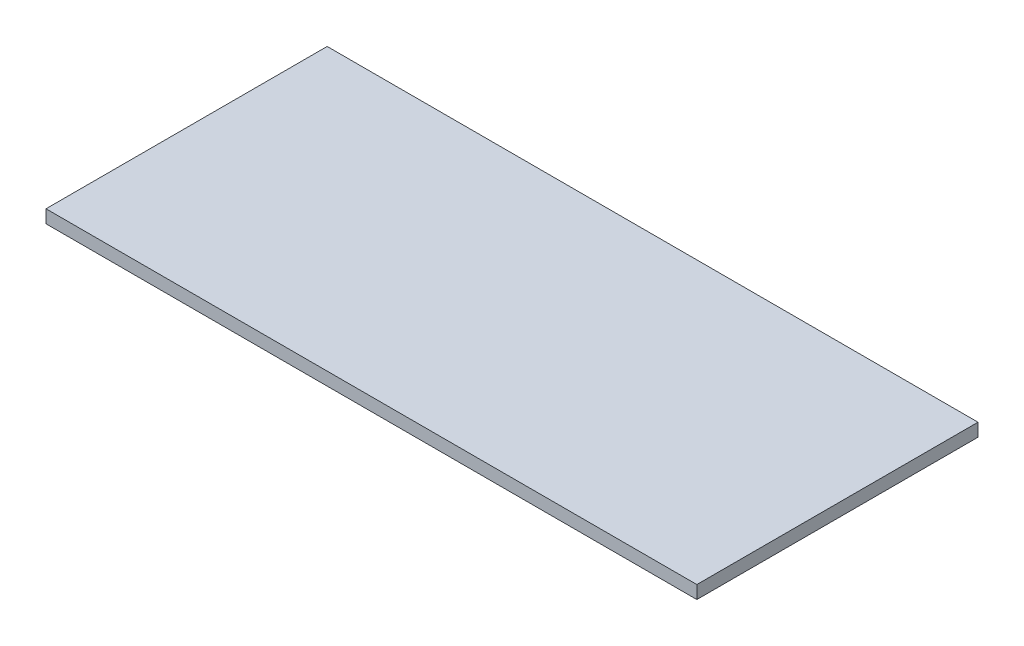
ISO-10303-21;
HEADER;
FILE_DESCRIPTION(('STEP AP214'),'2;1');
FILE_NAME('part.step','',(''),(''),'','','');
FILE_SCHEMA(('AUTOMOTIVE_DESIGN { 1 0 10303 214 1 1 1 1 }'));
ENDSEC;
DATA;
#1=APPLICATION_CONTEXT('core data for automotive mechanical design processes');
#2=APPLICATION_PROTOCOL_DEFINITION('international standard','automotive_design',2000,#1);
#3=PRODUCT_CONTEXT('',#1,'mechanical');
#4=PRODUCT('Part','Part','',(#3));
#5=PRODUCT_RELATED_PRODUCT_CATEGORY('part','',(#4));
#6=PRODUCT_DEFINITION_FORMATION('','',#4);
#7=PRODUCT_DEFINITION_CONTEXT('part definition',#1,'design');
#8=PRODUCT_DEFINITION('design','',#6,#7);
#9=PRODUCT_DEFINITION_SHAPE('','',#8);
#10=(LENGTH_UNIT() NAMED_UNIT(*) SI_UNIT(.MILLI.,.METRE.));
#11=(NAMED_UNIT(*) PLANE_ANGLE_UNIT() SI_UNIT($,.RADIAN.));
#12=(NAMED_UNIT(*) SI_UNIT($,.STERADIAN.) SOLID_ANGLE_UNIT());
#13=UNCERTAINTY_MEASURE_WITH_UNIT(LENGTH_MEASURE(1.E-05),#10,'distance_accuracy_value','');
#14=(GEOMETRIC_REPRESENTATION_CONTEXT(3) GLOBAL_UNCERTAINTY_ASSIGNED_CONTEXT((#13)) GLOBAL_UNIT_ASSIGNED_CONTEXT((#10,
#11,#12)) REPRESENTATION_CONTEXT('',''));
#15=CARTESIAN_POINT('',(0.,0.,0.));
#16=DIRECTION('',(0.,0.,1.));
#17=DIRECTION('',(1.,0.,0.));
#18=AXIS2_PLACEMENT_3D('',#15,#16,#17);
#19=CARTESIAN_POINT('',(1250.,50.,-540.));
#20=DIRECTION('',(-1.,0.,0.));
#21=DIRECTION('',(0.,0.,1.));
#22=AXIS2_PLACEMENT_3D('',#19,#20,#21);
#23=PLANE('',#22);
#24=DIRECTION('',(0.,0.,-1.));
#25=VECTOR('',#24,1.);
#26=CARTESIAN_POINT('',(1250.,0.,-540.));
#27=LINE('',#26,#25);
#28=CARTESIAN_POINT('',(1250.,0.,540.));
#29=VERTEX_POINT('',#28);
#30=CARTESIAN_POINT('',(1250.,0.,-540.));
#31=VERTEX_POINT('',#30);
#32=EDGE_CURVE('E96',#29,#31,#27,.T.);
#33=ORIENTED_EDGE('',*,*,#32,.T.);
#34=DIRECTION('',(0.,-1.,0.));
#35=VECTOR('',#34,1.);
#36=CARTESIAN_POINT('',(1250.,50.,-540.));
#37=LINE('',#36,#35);
#38=CARTESIAN_POINT('',(1250.,50.,-540.));
#39=VERTEX_POINT('',#38);
#40=EDGE_CURVE('E11',#39,#31,#37,.T.);
#41=ORIENTED_EDGE('',*,*,#40,.F.);
#42=DIRECTION('',(0.,0.,-1.));
#43=VECTOR('',#42,1.);
#44=CARTESIAN_POINT('',(1250.,50.,-540.));
#45=LINE('',#44,#43);
#46=CARTESIAN_POINT('',(1250.,50.,540.));
#47=VERTEX_POINT('',#46);
#48=EDGE_CURVE('E84',#47,#39,#45,.T.);
#49=ORIENTED_EDGE('',*,*,#48,.F.);
#50=DIRECTION('',(0.,-1.,0.));
#51=VECTOR('',#50,1.);
#52=CARTESIAN_POINT('',(1250.,50.,540.));
#53=LINE('',#52,#51);
#54=EDGE_CURVE('E92',#47,#29,#53,.T.);
#55=ORIENTED_EDGE('',*,*,#54,.T.);
#56=EDGE_LOOP('',(#33,#41,#49,#55));
#57=FACE_BOUND('',#56,.T.);
#58=ADVANCED_FACE('F33',(#57),#23,.F.);
#59=CARTESIAN_POINT('',(-1250.,50.,-540.));
#60=DIRECTION('',(0.,0.,1.));
#61=DIRECTION('',(1.,0.,0.));
#62=AXIS2_PLACEMENT_3D('',#59,#60,#61);
#63=PLANE('',#62);
#64=DIRECTION('',(-1.,0.,0.));
#65=VECTOR('',#64,1.);
#66=CARTESIAN_POINT('',(-1250.,0.,-540.));
#67=LINE('',#66,#65);
#68=CARTESIAN_POINT('',(-1250.,0.,-540.));
#69=VERTEX_POINT('',#68);
#70=EDGE_CURVE('E88',#31,#69,#67,.T.);
#71=ORIENTED_EDGE('',*,*,#70,.T.);
#72=DIRECTION('',(0.,-1.,0.));
#73=VECTOR('',#72,1.);
#74=CARTESIAN_POINT('',(-1250.,50.,-540.));
#75=LINE('',#74,#73);
#76=CARTESIAN_POINT('',(-1250.,50.,-540.));
#77=VERTEX_POINT('',#76);
#78=EDGE_CURVE('E41',#77,#69,#75,.T.);
#79=ORIENTED_EDGE('',*,*,#78,.F.);
#80=DIRECTION('',(-1.,0.,0.));
#81=VECTOR('',#80,1.);
#82=CARTESIAN_POINT('',(-1250.,50.,-540.));
#83=LINE('',#82,#81);
#84=EDGE_CURVE('E79',#39,#77,#83,.T.);
#85=ORIENTED_EDGE('',*,*,#84,.F.);
#86=ORIENTED_EDGE('',*,*,#40,.T.);
#87=EDGE_LOOP('',(#71,#79,#85,#86));
#88=FACE_BOUND('',#87,.T.);
#89=ADVANCED_FACE('F87',(#88),#63,.F.);
#90=CARTESIAN_POINT('',(-1250.,50.,-540.));
#91=DIRECTION('',(1.,0.,0.));
#92=DIRECTION('',(0.,0.,-1.));
#93=AXIS2_PLACEMENT_3D('',#90,#91,#92);
#94=PLANE('',#93);
#95=DIRECTION('',(0.,0.,1.));
#96=VECTOR('',#95,1.);
#97=CARTESIAN_POINT('',(-1250.,0.,-540.));
#98=LINE('',#97,#96);
#99=CARTESIAN_POINT('',(-1250.,0.,540.));
#100=VERTEX_POINT('',#99);
#101=EDGE_CURVE('E66',#69,#100,#98,.T.);
#102=ORIENTED_EDGE('',*,*,#101,.T.);
#103=DIRECTION('',(0.,-1.,0.));
#104=VECTOR('',#103,1.);
#105=CARTESIAN_POINT('',(-1250.,50.,540.));
#106=LINE('',#105,#104);
#107=CARTESIAN_POINT('',(-1250.,50.,540.));
#108=VERTEX_POINT('',#107);
#109=EDGE_CURVE('E89',#108,#100,#106,.T.);
#110=ORIENTED_EDGE('',*,*,#109,.F.);
#111=DIRECTION('',(0.,0.,1.));
#112=VECTOR('',#111,1.);
#113=CARTESIAN_POINT('',(-1250.,50.,-540.));
#114=LINE('',#113,#112);
#115=EDGE_CURVE('E82',#77,#108,#114,.T.);
#116=ORIENTED_EDGE('',*,*,#115,.F.);
#117=ORIENTED_EDGE('',*,*,#78,.T.);
#118=EDGE_LOOP('',(#102,#110,#116,#117));
#119=FACE_BOUND('',#118,.T.);
#120=ADVANCED_FACE('F90',(#119),#94,.F.);
#121=CARTESIAN_POINT('',(-1250.,50.,540.));
#122=DIRECTION('',(0.,0.,-1.));
#123=DIRECTION('',(-1.,0.,0.));
#124=AXIS2_PLACEMENT_3D('',#121,#122,#123);
#125=PLANE('',#124);
#126=DIRECTION('',(1.,0.,0.));
#127=VECTOR('',#126,1.);
#128=CARTESIAN_POINT('',(-1250.,0.,540.));
#129=LINE('',#128,#127);
#130=EDGE_CURVE('E72',#100,#29,#129,.T.);
#131=ORIENTED_EDGE('',*,*,#130,.T.);
#132=ORIENTED_EDGE('',*,*,#54,.F.);
#133=DIRECTION('',(1.,0.,0.));
#134=VECTOR('',#133,1.);
#135=CARTESIAN_POINT('',(-1250.,50.,540.));
#136=LINE('',#135,#134);
#137=EDGE_CURVE('E49',#108,#47,#136,.T.);
#138=ORIENTED_EDGE('',*,*,#137,.F.);
#139=ORIENTED_EDGE('',*,*,#109,.T.);
#140=EDGE_LOOP('',(#131,#132,#138,#139));
#141=FACE_BOUND('',#140,.T.);
#142=ADVANCED_FACE('F103',(#141),#125,.F.);
#143=CARTESIAN_POINT('',(0.,50.,0.));
#144=DIRECTION('',(0.,1.,0.));
#145=DIRECTION('',(0.,0.,1.));
#146=AXIS2_PLACEMENT_3D('',#143,#144,#145);
#147=PLANE('',#146);
#148=ORIENTED_EDGE('',*,*,#48,.T.);
#149=ORIENTED_EDGE('',*,*,#84,.T.);
#150=ORIENTED_EDGE('',*,*,#115,.T.);
#151=ORIENTED_EDGE('',*,*,#137,.T.);
#152=EDGE_LOOP('',(#148,#149,#150,#151));
#153=FACE_BOUND('',#152,.T.);
#154=ADVANCED_FACE('F80',(#153),#147,.T.);
#155=CARTESIAN_POINT('',(0.,0.,0.));
#156=DIRECTION('',(0.,1.,0.));
#157=DIRECTION('',(0.,0.,1.));
#158=AXIS2_PLACEMENT_3D('',#155,#156,#157);
#159=PLANE('',#158);
#160=ORIENTED_EDGE('',*,*,#32,.F.);
#161=ORIENTED_EDGE('',*,*,#130,.F.);
#162=ORIENTED_EDGE('',*,*,#101,.F.);
#163=ORIENTED_EDGE('',*,*,#70,.F.);
#164=EDGE_LOOP('',(#160,#161,#162,#163));
#165=FACE_BOUND('',#164,.T.);
#166=ADVANCED_FACE('F106',(#165),#159,.F.);
#167=CLOSED_SHELL('',(#58,#89,#120,#142,#154,#166));
#168=MANIFOLD_SOLID_BREP('B2',#167);
#169=ADVANCED_BREP_SHAPE_REPRESENTATION('',(#18,#168),#14);
#170=SHAPE_DEFINITION_REPRESENTATION(#9,#169);
ENDSEC;
END-ISO-10303-21;
